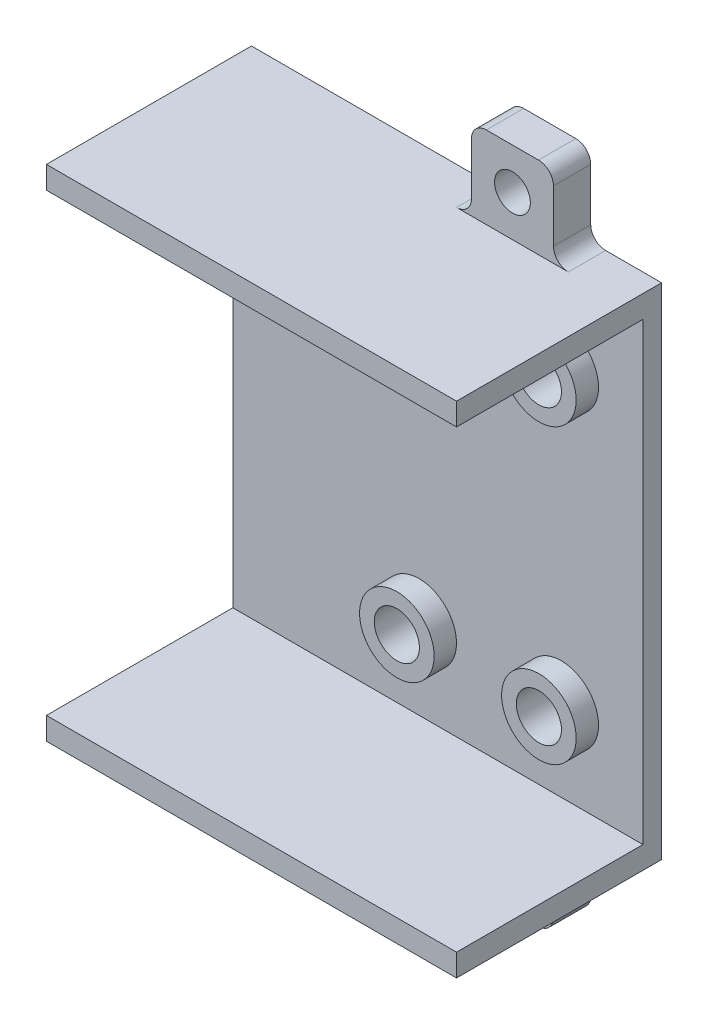
ISO-10303-21;
HEADER;
FILE_DESCRIPTION(('STEP AP214'),'2;1');
FILE_NAME('part.step','',(''),(''),'','','');
FILE_SCHEMA(('AUTOMOTIVE_DESIGN { 1 0 10303 214 1 1 1 1 }'));
ENDSEC;
DATA;
#1=APPLICATION_CONTEXT('core data for automotive mechanical design processes');
#2=APPLICATION_PROTOCOL_DEFINITION('international standard','automotive_design',2000,#1);
#3=PRODUCT_CONTEXT('',#1,'mechanical');
#4=PRODUCT('Part','Part','',(#3));
#5=PRODUCT_RELATED_PRODUCT_CATEGORY('part','',(#4));
#6=PRODUCT_DEFINITION_FORMATION('','',#4);
#7=PRODUCT_DEFINITION_CONTEXT('part definition',#1,'design');
#8=PRODUCT_DEFINITION('design','',#6,#7);
#9=PRODUCT_DEFINITION_SHAPE('','',#8);
#10=(LENGTH_UNIT() NAMED_UNIT(*) SI_UNIT(.MILLI.,.METRE.));
#11=(NAMED_UNIT(*) PLANE_ANGLE_UNIT() SI_UNIT($,.RADIAN.));
#12=(NAMED_UNIT(*) SI_UNIT($,.STERADIAN.) SOLID_ANGLE_UNIT());
#13=UNCERTAINTY_MEASURE_WITH_UNIT(LENGTH_MEASURE(1.E-05),#10,'distance_accuracy_value','');
#14=(GEOMETRIC_REPRESENTATION_CONTEXT(3) GLOBAL_UNCERTAINTY_ASSIGNED_CONTEXT((#13)) GLOBAL_UNIT_ASSIGNED_CONTEXT((#10,
#11,#12)) REPRESENTATION_CONTEXT('',''));
#15=CARTESIAN_POINT('',(0.,0.,0.));
#16=DIRECTION('',(0.,0.,1.));
#17=DIRECTION('',(1.,0.,0.));
#18=AXIS2_PLACEMENT_3D('',#15,#16,#17);
#19=CARTESIAN_POINT('',(-27.5,-33.5,2.5));
#20=DIRECTION('',(0.,1.,0.));
#21=DIRECTION('',(0.,0.,1.));
#22=AXIS2_PLACEMENT_3D('',#19,#20,#21);
#23=PLANE('',#22);
#24=DIRECTION('',(1.,0.,0.));
#25=VECTOR('',#24,1.);
#26=CARTESIAN_POINT('',(0.,-33.5,5.));
#27=LINE('',#26,#25);
#28=CARTESIAN_POINT('',(5.,-33.5,5.));
#29=VERTEX_POINT('',#28);
#30=CARTESIAN_POINT('',(20.,-33.5,5.));
#31=VERTEX_POINT('',#30);
#32=EDGE_CURVE('E480',#29,#31,#27,.T.);
#33=ORIENTED_EDGE('',*,*,#32,.T.);
#34=DIRECTION('',(0.,0.,-1.));
#35=VECTOR('',#34,1.);
#36=CARTESIAN_POINT('',(20.,-33.5,2.5));
#37=LINE('',#36,#35);
#38=CARTESIAN_POINT('',(20.,-33.5,0.));
#39=VERTEX_POINT('',#38);
#40=EDGE_CURVE('E286',#31,#39,#37,.T.);
#41=ORIENTED_EDGE('',*,*,#40,.T.);
#42=DIRECTION('',(1.,0.,0.));
#43=VECTOR('',#42,1.);
#44=CARTESIAN_POINT('',(-27.5,-33.5,0.));
#45=LINE('',#44,#43);
#46=CARTESIAN_POINT('',(27.5,-33.5,0.));
#47=VERTEX_POINT('',#46);
#48=EDGE_CURVE('E212',#39,#47,#45,.T.);
#49=ORIENTED_EDGE('',*,*,#48,.T.);
#50=DIRECTION('',(0.,0.,-1.));
#51=VECTOR('',#50,1.);
#52=CARTESIAN_POINT('',(27.5,-33.5,2.5));
#53=LINE('',#52,#51);
#54=CARTESIAN_POINT('',(27.5,-33.5,27.5));
#55=VERTEX_POINT('',#54);
#56=EDGE_CURVE('E206',#55,#47,#53,.T.);
#57=ORIENTED_EDGE('',*,*,#56,.F.);
#58=DIRECTION('',(1.,0.,0.));
#59=VECTOR('',#58,1.);
#60=CARTESIAN_POINT('',(27.5,-33.5,27.5));
#61=LINE('',#60,#59);
#62=CARTESIAN_POINT('',(-27.5,-33.5,27.5));
#63=VERTEX_POINT('',#62);
#64=EDGE_CURVE('E209',#63,#55,#61,.T.);
#65=ORIENTED_EDGE('',*,*,#64,.F.);
#66=DIRECTION('',(0.,0.,-1.));
#67=VECTOR('',#66,1.);
#68=CARTESIAN_POINT('',(-27.5,-33.5,2.5));
#69=LINE('',#68,#67);
#70=CARTESIAN_POINT('',(-27.5,-33.5,0.));
#71=VERTEX_POINT('',#70);
#72=EDGE_CURVE('E217',#63,#71,#69,.T.);
#73=ORIENTED_EDGE('',*,*,#72,.T.);
#74=CARTESIAN_POINT('',(4.99999999999999,-33.5,0.));
#75=VERTEX_POINT('',#74);
#76=EDGE_CURVE('E265',#71,#75,#45,.T.);
#77=ORIENTED_EDGE('',*,*,#76,.T.);
#78=DIRECTION('',(0.,0.,-1.));
#79=VECTOR('',#78,1.);
#80=CARTESIAN_POINT('',(5.,-33.5,5.));
#81=LINE('',#80,#79);
#82=EDGE_CURVE('E283',#75,#29,#81,.F.);
#83=ORIENTED_EDGE('',*,*,#82,.T.);
#84=EDGE_LOOP('',(#33,#41,#49,#57,#65,#73,#77,#83));
#85=FACE_BOUND('',#84,.T.);
#86=ADVANCED_FACE('F43',(#85),#23,.F.);
#87=CARTESIAN_POINT('',(-27.5,33.5,2.5));
#88=DIRECTION('',(0.,-1.,0.));
#89=DIRECTION('',(0.,0.,-1.));
#90=AXIS2_PLACEMENT_3D('',#87,#88,#89);
#91=PLANE('',#90);
#92=DIRECTION('',(-1.,0.,0.));
#93=VECTOR('',#92,1.);
#94=CARTESIAN_POINT('',(-27.5,33.5,0.));
#95=LINE('',#94,#93);
#96=CARTESIAN_POINT('',(27.5,33.5,0.));
#97=VERTEX_POINT('',#96);
#98=CARTESIAN_POINT('',(20.,33.5,0.));
#99=VERTEX_POINT('',#98);
#100=EDGE_CURVE('E269',#97,#99,#95,.T.);
#101=ORIENTED_EDGE('',*,*,#100,.T.);
#102=DIRECTION('',(0.,0.,-1.));
#103=VECTOR('',#102,1.);
#104=CARTESIAN_POINT('',(20.,33.5,5.));
#105=LINE('',#104,#103);
#106=CARTESIAN_POINT('',(20.,33.5,5.));
#107=VERTEX_POINT('',#106);
#108=EDGE_CURVE('E323',#99,#107,#105,.F.);
#109=ORIENTED_EDGE('',*,*,#108,.T.);
#110=DIRECTION('',(1.,0.,0.));
#111=VECTOR('',#110,1.);
#112=CARTESIAN_POINT('',(0.,33.5,5.));
#113=LINE('',#112,#111);
#114=CARTESIAN_POINT('',(5.,33.5,5.));
#115=VERTEX_POINT('',#114);
#116=EDGE_CURVE('E367',#115,#107,#113,.T.);
#117=ORIENTED_EDGE('',*,*,#116,.F.);
#118=DIRECTION('',(0.,0.,-1.));
#119=VECTOR('',#118,1.);
#120=CARTESIAN_POINT('',(5.,33.5,2.5));
#121=LINE('',#120,#119);
#122=CARTESIAN_POINT('',(5.,33.5,0.));
#123=VERTEX_POINT('',#122);
#124=EDGE_CURVE('E320',#115,#123,#121,.T.);
#125=ORIENTED_EDGE('',*,*,#124,.T.);
#126=CARTESIAN_POINT('',(-27.5,33.5,0.));
#127=VERTEX_POINT('',#126);
#128=EDGE_CURVE('E268',#123,#127,#95,.T.);
#129=ORIENTED_EDGE('',*,*,#128,.T.);
#130=DIRECTION('',(0.,0.,-1.));
#131=VECTOR('',#130,1.);
#132=CARTESIAN_POINT('',(-27.5,33.5,2.5));
#133=LINE('',#132,#131);
#134=CARTESIAN_POINT('',(-27.5,33.5,27.5));
#135=VERTEX_POINT('',#134);
#136=EDGE_CURVE('E277',#135,#127,#133,.T.);
#137=ORIENTED_EDGE('',*,*,#136,.F.);
#138=DIRECTION('',(-1.,0.,0.));
#139=VECTOR('',#138,1.);
#140=CARTESIAN_POINT('',(-27.5,33.5,27.5));
#141=LINE('',#140,#139);
#142=CARTESIAN_POINT('',(27.5,33.5,27.5));
#143=VERTEX_POINT('',#142);
#144=EDGE_CURVE('E251',#143,#135,#141,.T.);
#145=ORIENTED_EDGE('',*,*,#144,.F.);
#146=DIRECTION('',(0.,0.,-1.));
#147=VECTOR('',#146,1.);
#148=CARTESIAN_POINT('',(27.5,33.5,2.5));
#149=LINE('',#148,#147);
#150=EDGE_CURVE('E280',#143,#97,#149,.T.);
#151=ORIENTED_EDGE('',*,*,#150,.T.);
#152=EDGE_LOOP('',(#101,#109,#117,#125,#129,#137,#145,#151));
#153=FACE_BOUND('',#152,.T.);
#154=ADVANCED_FACE('F448',(#153),#91,.F.);
#155=CARTESIAN_POINT('',(0.,0.,2.5));
#156=DIRECTION('',(0.,0.,1.));
#157=DIRECTION('',(1.,0.,0.));
#158=AXIS2_PLACEMENT_3D('',#155,#156,#157);
#159=PLANE('',#158);
#160=CARTESIAN_POINT('',(-2.50399999999998,-19.6215,2.5));
#161=DIRECTION('',(0.,0.,1.));
#162=DIRECTION('',(1.,0.,0.));
#163=AXIS2_PLACEMENT_3D('',#160,#161,#162);
#164=CIRCLE('',#163,5.);
#165=CARTESIAN_POINT('',(2.49600000000002,-19.6215,2.5));
#166=VERTEX_POINT('',#165);
#167=EDGE_CURVE('E393',#166,#166,#164,.T.);
#168=ORIENTED_EDGE('',*,*,#167,.F.);
#169=EDGE_LOOP('',(#168));
#170=FACE_BOUND('',#169,.T.);
#171=CARTESIAN_POINT('',(16.546,-19.6215,2.5));
#172=DIRECTION('',(0.,0.,1.));
#173=DIRECTION('',(1.,0.,0.));
#174=AXIS2_PLACEMENT_3D('',#171,#172,#173);
#175=CIRCLE('',#174,5.);
#176=CARTESIAN_POINT('',(21.546,-19.6215,2.5));
#177=VERTEX_POINT('',#176);
#178=EDGE_CURVE('E402',#177,#177,#175,.T.);
#179=ORIENTED_EDGE('',*,*,#178,.F.);
#180=EDGE_LOOP('',(#179));
#181=FACE_BOUND('',#180,.T.);
#182=CARTESIAN_POINT('',(16.546,19.6215,2.5));
#183=DIRECTION('',(0.,0.,1.));
#184=DIRECTION('',(1.,0.,0.));
#185=AXIS2_PLACEMENT_3D('',#182,#183,#184);
#186=CIRCLE('',#185,5.);
#187=CARTESIAN_POINT('',(21.546,19.6215,2.5));
#188=VERTEX_POINT('',#187);
#189=EDGE_CURVE('E411',#188,#188,#186,.T.);
#190=ORIENTED_EDGE('',*,*,#189,.F.);
#191=EDGE_LOOP('',(#190));
#192=FACE_BOUND('',#191,.T.);
#193=CARTESIAN_POINT('',(-2.50399999999998,19.6215,2.5));
#194=DIRECTION('',(0.,0.,1.));
#195=DIRECTION('',(1.,0.,0.));
#196=AXIS2_PLACEMENT_3D('',#193,#194,#195);
#197=CIRCLE('',#196,5.);
#198=CARTESIAN_POINT('',(2.49600000000002,19.6215,2.5));
#199=VERTEX_POINT('',#198);
#200=EDGE_CURVE('E422',#199,#199,#197,.T.);
#201=ORIENTED_EDGE('',*,*,#200,.F.);
#202=EDGE_LOOP('',(#201));
#203=FACE_BOUND('',#202,.T.);
#204=DIRECTION('',(0.,-1.,0.));
#205=VECTOR('',#204,1.);
#206=CARTESIAN_POINT('',(-27.5,33.5,2.5));
#207=LINE('',#206,#205);
#208=CARTESIAN_POINT('',(-27.5,30.5,2.5));
#209=VERTEX_POINT('',#208);
#210=CARTESIAN_POINT('',(-27.5,-30.5,2.5));
#211=VERTEX_POINT('',#210);
#212=EDGE_CURVE('E218',#209,#211,#207,.T.);
#213=ORIENTED_EDGE('',*,*,#212,.T.);
#214=DIRECTION('',(-1.,0.,0.));
#215=VECTOR('',#214,1.);
#216=CARTESIAN_POINT('',(27.5,-30.5,2.5));
#217=LINE('',#216,#215);
#218=CARTESIAN_POINT('',(27.5,-30.5,2.5));
#219=VERTEX_POINT('',#218);
#220=EDGE_CURVE('E234',#219,#211,#217,.T.);
#221=ORIENTED_EDGE('',*,*,#220,.F.);
#222=DIRECTION('',(0.,1.,0.));
#223=VECTOR('',#222,1.);
#224=CARTESIAN_POINT('',(27.5,33.5,2.5));
#225=LINE('',#224,#223);
#226=CARTESIAN_POINT('',(27.5,30.5,2.5));
#227=VERTEX_POINT('',#226);
#228=EDGE_CURVE('E263',#219,#227,#225,.T.);
#229=ORIENTED_EDGE('',*,*,#228,.T.);
#230=DIRECTION('',(1.,0.,0.));
#231=VECTOR('',#230,1.);
#232=CARTESIAN_POINT('',(-27.5,30.5,2.5));
#233=LINE('',#232,#231);
#234=EDGE_CURVE('E238',#209,#227,#233,.T.);
#235=ORIENTED_EDGE('',*,*,#234,.F.);
#236=EDGE_LOOP('',(#213,#221,#229,#235));
#237=FACE_BOUND('',#236,.T.);
#238=ADVANCED_FACE('F438',(#170,#181,#192,#203,#237),#159,.T.);
#239=CARTESIAN_POINT('',(27.5,33.5,2.5));
#240=DIRECTION('',(-1.,0.,0.));
#241=DIRECTION('',(0.,-1.,0.));
#242=AXIS2_PLACEMENT_3D('',#239,#240,#241);
#243=PLANE('',#242);
#244=DIRECTION('',(0.,1.,0.));
#245=VECTOR('',#244,1.);
#246=CARTESIAN_POINT('',(27.5,33.5,0.));
#247=LINE('',#246,#245);
#248=EDGE_CURVE('E262',#47,#97,#247,.T.);
#249=ORIENTED_EDGE('',*,*,#248,.T.);
#250=ORIENTED_EDGE('',*,*,#150,.F.);
#251=DIRECTION('',(0.,1.,0.));
#252=VECTOR('',#251,1.);
#253=CARTESIAN_POINT('',(27.5,33.5,27.5));
#254=LINE('',#253,#252);
#255=CARTESIAN_POINT('',(27.5,30.5,27.5));
#256=VERTEX_POINT('',#255);
#257=EDGE_CURVE('E248',#256,#143,#254,.T.);
#258=ORIENTED_EDGE('',*,*,#257,.F.);
#259=DIRECTION('',(0.,0.,-1.));
#260=VECTOR('',#259,1.);
#261=CARTESIAN_POINT('',(27.5,30.5,27.5));
#262=LINE('',#261,#260);
#263=EDGE_CURVE('E254',#256,#227,#262,.T.);
#264=ORIENTED_EDGE('',*,*,#263,.T.);
#265=ORIENTED_EDGE('',*,*,#228,.F.);
#266=DIRECTION('',(0.,0.,-1.));
#267=VECTOR('',#266,1.);
#268=CARTESIAN_POINT('',(27.5,-30.5,27.5));
#269=LINE('',#268,#267);
#270=CARTESIAN_POINT('',(27.5,-30.5,27.5));
#271=VERTEX_POINT('',#270);
#272=EDGE_CURVE('E233',#271,#219,#269,.T.);
#273=ORIENTED_EDGE('',*,*,#272,.F.);
#274=DIRECTION('',(0.,1.,0.));
#275=VECTOR('',#274,1.);
#276=CARTESIAN_POINT('',(27.5,-33.5,27.5));
#277=LINE('',#276,#275);
#278=EDGE_CURVE('E224',#55,#271,#277,.T.);
#279=ORIENTED_EDGE('',*,*,#278,.F.);
#280=ORIENTED_EDGE('',*,*,#56,.T.);
#281=EDGE_LOOP('',(#249,#250,#258,#264,#265,#273,#279,#280));
#282=FACE_BOUND('',#281,.T.);
#283=ADVANCED_FACE('F230',(#282),#243,.F.);
#284=CARTESIAN_POINT('',(-27.5,33.5,2.5));
#285=DIRECTION('',(1.,0.,0.));
#286=DIRECTION('',(0.,1.,0.));
#287=AXIS2_PLACEMENT_3D('',#284,#285,#286);
#288=PLANE('',#287);
#289=DIRECTION('',(0.,-1.,0.));
#290=VECTOR('',#289,1.);
#291=CARTESIAN_POINT('',(-27.5,33.5,0.));
#292=LINE('',#291,#290);
#293=EDGE_CURVE('E272',#127,#71,#292,.T.);
#294=ORIENTED_EDGE('',*,*,#293,.T.);
#295=ORIENTED_EDGE('',*,*,#72,.F.);
#296=DIRECTION('',(0.,-1.,0.));
#297=VECTOR('',#296,1.);
#298=CARTESIAN_POINT('',(-27.5,-33.5,27.5));
#299=LINE('',#298,#297);
#300=CARTESIAN_POINT('',(-27.5,-30.5,27.5));
#301=VERTEX_POINT('',#300);
#302=EDGE_CURVE('E227',#301,#63,#299,.T.);
#303=ORIENTED_EDGE('',*,*,#302,.F.);
#304=DIRECTION('',(0.,0.,-1.));
#305=VECTOR('',#304,1.);
#306=CARTESIAN_POINT('',(-27.5,-30.5,27.5));
#307=LINE('',#306,#305);
#308=EDGE_CURVE('E228',#301,#211,#307,.T.);
#309=ORIENTED_EDGE('',*,*,#308,.T.);
#310=ORIENTED_EDGE('',*,*,#212,.F.);
#311=DIRECTION('',(0.,0.,-1.));
#312=VECTOR('',#311,1.);
#313=CARTESIAN_POINT('',(-27.5,30.5,27.5));
#314=LINE('',#313,#312);
#315=CARTESIAN_POINT('',(-27.5,30.5,27.5));
#316=VERTEX_POINT('',#315);
#317=EDGE_CURVE('E259',#316,#209,#314,.T.);
#318=ORIENTED_EDGE('',*,*,#317,.F.);
#319=DIRECTION('',(0.,-1.,0.));
#320=VECTOR('',#319,1.);
#321=CARTESIAN_POINT('',(-27.5,33.5,27.5));
#322=LINE('',#321,#320);
#323=EDGE_CURVE('E243',#135,#316,#322,.T.);
#324=ORIENTED_EDGE('',*,*,#323,.F.);
#325=ORIENTED_EDGE('',*,*,#136,.T.);
#326=EDGE_LOOP('',(#294,#295,#303,#309,#310,#318,#324,#325));
#327=FACE_BOUND('',#326,.T.);
#328=ADVANCED_FACE('F433',(#327),#288,.F.);
#329=CARTESIAN_POINT('',(0.,0.,0.));
#330=DIRECTION('',(0.,0.,1.));
#331=DIRECTION('',(1.,0.,0.));
#332=AXIS2_PLACEMENT_3D('',#329,#330,#331);
#333=PLANE('',#332);
#334=CARTESIAN_POINT('',(12.5,-39.,0.));
#335=DIRECTION('',(0.,0.,1.));
#336=DIRECTION('',(1.,0.,0.));
#337=AXIS2_PLACEMENT_3D('',#334,#335,#336);
#338=CIRCLE('',#337,2.4);
#339=CARTESIAN_POINT('',(14.9,-39.,0.));
#340=VERTEX_POINT('',#339);
#341=EDGE_CURVE('E477',#340,#340,#338,.T.);
#342=ORIENTED_EDGE('',*,*,#341,.T.);
#343=EDGE_LOOP('',(#342));
#344=FACE_BOUND('',#343,.T.);
#345=CARTESIAN_POINT('',(12.5,39.,0.));
#346=DIRECTION('',(0.,0.,1.));
#347=DIRECTION('',(1.,0.,0.));
#348=AXIS2_PLACEMENT_3D('',#345,#346,#347);
#349=CIRCLE('',#348,2.4);
#350=CARTESIAN_POINT('',(14.9,39.,0.));
#351=VERTEX_POINT('',#350);
#352=EDGE_CURVE('E381',#351,#351,#349,.T.);
#353=ORIENTED_EDGE('',*,*,#352,.T.);
#354=EDGE_LOOP('',(#353));
#355=FACE_BOUND('',#354,.T.);
#356=DIRECTION('',(0.,-1.,0.));
#357=VECTOR('',#356,1.);
#358=CARTESIAN_POINT('',(18.,0.,0.));
#359=LINE('',#358,#357);
#360=CARTESIAN_POINT('',(18.,-35.5,0.));
#361=VERTEX_POINT('',#360);
#362=CARTESIAN_POINT('',(18.,-42.5,0.));
#363=VERTEX_POINT('',#362);
#364=EDGE_CURVE('E468',#361,#363,#359,.T.);
#365=ORIENTED_EDGE('',*,*,#364,.T.);
#366=CARTESIAN_POINT('',(16.,-42.5,0.));
#367=DIRECTION('',(0.,0.,1.));
#368=DIRECTION('',(1.,0.,0.));
#369=AXIS2_PLACEMENT_3D('',#366,#367,#368);
#370=CIRCLE('',#369,2.);
#371=CARTESIAN_POINT('',(16.,-44.5,0.));
#372=VERTEX_POINT('',#371);
#373=EDGE_CURVE('E299',#363,#372,#370,.F.);
#374=ORIENTED_EDGE('',*,*,#373,.T.);
#375=DIRECTION('',(-1.,0.,0.));
#376=VECTOR('',#375,1.);
#377=CARTESIAN_POINT('',(0.,-44.5,0.));
#378=LINE('',#377,#376);
#379=CARTESIAN_POINT('',(9.,-44.5,0.));
#380=VERTEX_POINT('',#379);
#381=EDGE_CURVE('E474',#372,#380,#378,.T.);
#382=ORIENTED_EDGE('',*,*,#381,.T.);
#383=CARTESIAN_POINT('',(9.,-42.5,0.));
#384=DIRECTION('',(0.,0.,1.));
#385=DIRECTION('',(1.,0.,0.));
#386=AXIS2_PLACEMENT_3D('',#383,#384,#385);
#387=CIRCLE('',#386,2.);
#388=CARTESIAN_POINT('',(7.,-42.5,0.));
#389=VERTEX_POINT('',#388);
#390=EDGE_CURVE('E297',#380,#389,#387,.F.);
#391=ORIENTED_EDGE('',*,*,#390,.T.);
#392=DIRECTION('',(0.,-1.,0.));
#393=VECTOR('',#392,1.);
#394=CARTESIAN_POINT('',(6.99999999999999,0.,0.));
#395=LINE('',#394,#393);
#396=CARTESIAN_POINT('',(7.,-35.5,0.));
#397=VERTEX_POINT('',#396);
#398=EDGE_CURVE('E471',#397,#389,#395,.T.);
#399=ORIENTED_EDGE('',*,*,#398,.F.);
#400=CARTESIAN_POINT('',(5.,-35.5,0.));
#401=DIRECTION('',(0.,0.,1.));
#402=DIRECTION('',(1.,0.,0.));
#403=AXIS2_PLACEMENT_3D('',#400,#401,#402);
#404=CIRCLE('',#403,2.);
#405=EDGE_CURVE('E343',#397,#75,#404,.T.);
#406=ORIENTED_EDGE('',*,*,#405,.T.);
#407=ORIENTED_EDGE('',*,*,#76,.F.);
#408=ORIENTED_EDGE('',*,*,#293,.F.);
#409=ORIENTED_EDGE('',*,*,#128,.F.);
#410=CARTESIAN_POINT('',(5.,35.5,0.));
#411=DIRECTION('',(0.,0.,1.));
#412=DIRECTION('',(1.,0.,0.));
#413=AXIS2_PLACEMENT_3D('',#410,#411,#412);
#414=CIRCLE('',#413,2.);
#415=CARTESIAN_POINT('',(7.,35.5,0.));
#416=VERTEX_POINT('',#415);
#417=EDGE_CURVE('E51',#123,#416,#414,.T.);
#418=ORIENTED_EDGE('',*,*,#417,.T.);
#419=DIRECTION('',(0.,1.,0.));
#420=VECTOR('',#419,1.);
#421=CARTESIAN_POINT('',(6.99999999999999,0.,0.));
#422=LINE('',#421,#420);
#423=CARTESIAN_POINT('',(7.,42.5,0.));
#424=VERTEX_POINT('',#423);
#425=EDGE_CURVE('E355',#416,#424,#422,.T.);
#426=ORIENTED_EDGE('',*,*,#425,.T.);
#427=CARTESIAN_POINT('',(9.,42.5,0.));
#428=DIRECTION('',(0.,0.,1.));
#429=DIRECTION('',(1.,0.,0.));
#430=AXIS2_PLACEMENT_3D('',#427,#428,#429);
#431=CIRCLE('',#430,2.);
#432=CARTESIAN_POINT('',(9.,44.5,0.));
#433=VERTEX_POINT('',#432);
#434=EDGE_CURVE('E293',#424,#433,#431,.F.);
#435=ORIENTED_EDGE('',*,*,#434,.T.);
#436=DIRECTION('',(-1.,0.,0.));
#437=VECTOR('',#436,1.);
#438=CARTESIAN_POINT('',(0.,44.5,0.));
#439=LINE('',#438,#437);
#440=CARTESIAN_POINT('',(16.,44.5,0.));
#441=VERTEX_POINT('',#440);
#442=EDGE_CURVE('E378',#441,#433,#439,.T.);
#443=ORIENTED_EDGE('',*,*,#442,.F.);
#444=CARTESIAN_POINT('',(16.,42.5,0.));
#445=DIRECTION('',(0.,0.,1.));
#446=DIRECTION('',(1.,0.,0.));
#447=AXIS2_PLACEMENT_3D('',#444,#445,#446);
#448=CIRCLE('',#447,2.);
#449=CARTESIAN_POINT('',(18.,42.5,0.));
#450=VERTEX_POINT('',#449);
#451=EDGE_CURVE('E295',#441,#450,#448,.F.);
#452=ORIENTED_EDGE('',*,*,#451,.T.);
#453=DIRECTION('',(0.,1.,0.));
#454=VECTOR('',#453,1.);
#455=CARTESIAN_POINT('',(18.,0.,0.));
#456=LINE('',#455,#454);
#457=CARTESIAN_POINT('',(18.,35.5,0.));
#458=VERTEX_POINT('',#457);
#459=EDGE_CURVE('E362',#458,#450,#456,.T.);
#460=ORIENTED_EDGE('',*,*,#459,.F.);
#461=CARTESIAN_POINT('',(20.,35.5,0.));
#462=DIRECTION('',(0.,0.,1.));
#463=DIRECTION('',(1.,0.,0.));
#464=AXIS2_PLACEMENT_3D('',#461,#462,#463);
#465=CIRCLE('',#464,2.);
#466=EDGE_CURVE('E347',#458,#99,#465,.T.);
#467=ORIENTED_EDGE('',*,*,#466,.T.);
#468=ORIENTED_EDGE('',*,*,#100,.F.);
#469=ORIENTED_EDGE('',*,*,#248,.F.);
#470=ORIENTED_EDGE('',*,*,#48,.F.);
#471=CARTESIAN_POINT('',(20.,-35.5,0.));
#472=DIRECTION('',(0.,0.,1.));
#473=DIRECTION('',(1.,0.,0.));
#474=AXIS2_PLACEMENT_3D('',#471,#472,#473);
#475=CIRCLE('',#474,2.);
#476=EDGE_CURVE('E338',#39,#361,#475,.T.);
#477=ORIENTED_EDGE('',*,*,#476,.T.);
#478=EDGE_LOOP('',(#365,#374,#382,#391,#399,#406,#407,#408,#409,#418,#426,#435,#443,#452,#460,
#467,#468,#469,#470,#477));
#479=FACE_BOUND('',#478,.T.);
#480=ADVANCED_FACE('F354',(#344,#355,#479),#333,.F.);
#481=CARTESIAN_POINT('',(-27.5,30.5,27.5));
#482=DIRECTION('',(0.,1.,0.));
#483=DIRECTION('',(-1.,0.,0.));
#484=AXIS2_PLACEMENT_3D('',#481,#482,#483);
#485=PLANE('',#484);
#486=ORIENTED_EDGE('',*,*,#234,.T.);
#487=ORIENTED_EDGE('',*,*,#263,.F.);
#488=DIRECTION('',(1.,0.,0.));
#489=VECTOR('',#488,1.);
#490=CARTESIAN_POINT('',(-27.5,30.5,27.5));
#491=LINE('',#490,#489);
#492=EDGE_CURVE('E246',#316,#256,#491,.T.);
#493=ORIENTED_EDGE('',*,*,#492,.F.);
#494=ORIENTED_EDGE('',*,*,#317,.T.);
#495=EDGE_LOOP('',(#486,#487,#493,#494));
#496=FACE_BOUND('',#495,.T.);
#497=ADVANCED_FACE('F442',(#496),#485,.F.);
#498=CARTESIAN_POINT('',(0.,0.,27.5));
#499=DIRECTION('',(0.,0.,1.));
#500=DIRECTION('',(1.,0.,0.));
#501=AXIS2_PLACEMENT_3D('',#498,#499,#500);
#502=PLANE('',#501);
#503=ORIENTED_EDGE('',*,*,#323,.T.);
#504=ORIENTED_EDGE('',*,*,#492,.T.);
#505=ORIENTED_EDGE('',*,*,#257,.T.);
#506=ORIENTED_EDGE('',*,*,#144,.T.);
#507=EDGE_LOOP('',(#503,#504,#505,#506));
#508=FACE_BOUND('',#507,.T.);
#509=ADVANCED_FACE('F445',(#508),#502,.T.);
#510=CARTESIAN_POINT('',(27.5,-30.5,27.5));
#511=DIRECTION('',(0.,-1.,0.));
#512=DIRECTION('',(1.,0.,0.));
#513=AXIS2_PLACEMENT_3D('',#510,#511,#512);
#514=PLANE('',#513);
#515=ORIENTED_EDGE('',*,*,#220,.T.);
#516=ORIENTED_EDGE('',*,*,#308,.F.);
#517=DIRECTION('',(-1.,0.,0.));
#518=VECTOR('',#517,1.);
#519=CARTESIAN_POINT('',(27.5,-30.5,27.5));
#520=LINE('',#519,#518);
#521=EDGE_CURVE('E235',#271,#301,#520,.T.);
#522=ORIENTED_EDGE('',*,*,#521,.F.);
#523=ORIENTED_EDGE('',*,*,#272,.T.);
#524=EDGE_LOOP('',(#515,#516,#522,#523));
#525=FACE_BOUND('',#524,.T.);
#526=ADVANCED_FACE('F436',(#525),#514,.F.);
#527=CARTESIAN_POINT('',(0.,0.,27.5));
#528=DIRECTION('',(0.,0.,1.));
#529=DIRECTION('',(1.,0.,0.));
#530=AXIS2_PLACEMENT_3D('',#527,#528,#529);
#531=PLANE('',#530);
#532=ORIENTED_EDGE('',*,*,#278,.T.);
#533=ORIENTED_EDGE('',*,*,#521,.T.);
#534=ORIENTED_EDGE('',*,*,#302,.T.);
#535=ORIENTED_EDGE('',*,*,#64,.T.);
#536=EDGE_LOOP('',(#532,#533,#534,#535));
#537=FACE_BOUND('',#536,.T.);
#538=ADVANCED_FACE('F223',(#537),#531,.T.);
#539=CARTESIAN_POINT('',(-2.50399999999998,19.6215,5.5));
#540=DIRECTION('',(0.,0.,1.));
#541=DIRECTION('',(1.,0.,0.));
#542=AXIS2_PLACEMENT_3D('',#539,#540,#541);
#543=PLANE('',#542);
#544=CARTESIAN_POINT('',(-2.50399999999998,19.6215,5.5));
#545=DIRECTION('',(0.,0.,1.));
#546=DIRECTION('',(1.,0.,0.));
#547=AXIS2_PLACEMENT_3D('',#544,#545,#546);
#548=CIRCLE('',#547,5.);
#549=CARTESIAN_POINT('',(2.49600000000002,19.6215,5.5));
#550=VERTEX_POINT('',#549);
#551=EDGE_CURVE('E423',#550,#550,#548,.T.);
#552=ORIENTED_EDGE('',*,*,#551,.T.);
#553=EDGE_LOOP('',(#552));
#554=FACE_BOUND('',#553,.T.);
#555=CARTESIAN_POINT('',(-2.50399999999998,19.6215,5.5));
#556=DIRECTION('',(0.,0.,1.));
#557=DIRECTION('',(1.,0.,0.));
#558=AXIS2_PLACEMENT_3D('',#555,#556,#557);
#559=CIRCLE('',#558,3.025);
#560=CARTESIAN_POINT('',(0.521000000000021,19.6215,5.5));
#561=VERTEX_POINT('',#560);
#562=EDGE_CURVE('E419',#561,#561,#559,.T.);
#563=ORIENTED_EDGE('',*,*,#562,.F.);
#564=EDGE_LOOP('',(#563));
#565=FACE_BOUND('',#564,.T.);
#566=ADVANCED_FACE('F649',(#554,#565),#543,.T.);
#567=CARTESIAN_POINT('',(-2.50399999999998,19.6215,5.5));
#568=DIRECTION('',(0.,0.,-1.));
#569=DIRECTION('',(-1.,0.,0.));
#570=AXIS2_PLACEMENT_3D('',#567,#568,#569);
#571=CYLINDRICAL_SURFACE('',#570,5.);
#572=ORIENTED_EDGE('',*,*,#551,.F.);
#573=EDGE_LOOP('',(#572));
#574=FACE_BOUND('',#573,.T.);
#575=ORIENTED_EDGE('',*,*,#200,.T.);
#576=EDGE_LOOP('',(#575));
#577=FACE_BOUND('',#576,.T.);
#578=ADVANCED_FACE('F647',(#574,#577),#571,.T.);
#579=CARTESIAN_POINT('',(-2.50399999999998,19.6215,5.5));
#580=DIRECTION('',(0.,0.,-1.));
#581=DIRECTION('',(-1.,0.,0.));
#582=AXIS2_PLACEMENT_3D('',#579,#580,#581);
#583=CYLINDRICAL_SURFACE('',#582,3.025);
#584=ORIENTED_EDGE('',*,*,#562,.T.);
#585=EDGE_LOOP('',(#584));
#586=FACE_BOUND('',#585,.T.);
#587=CARTESIAN_POINT('',(-2.50399999999998,19.6215,0.5));
#588=DIRECTION('',(0.,0.,1.));
#589=DIRECTION('',(1.,0.,0.));
#590=AXIS2_PLACEMENT_3D('',#587,#588,#589);
#591=CIRCLE('',#590,3.025);
#592=CARTESIAN_POINT('',(0.521000000000021,19.6215,0.5));
#593=VERTEX_POINT('',#592);
#594=EDGE_CURVE('E369',#593,#593,#591,.T.);
#595=ORIENTED_EDGE('',*,*,#594,.F.);
#596=EDGE_LOOP('',(#595));
#597=FACE_BOUND('',#596,.T.);
#598=ADVANCED_FACE('F640',(#586,#597),#583,.F.);
#599=CARTESIAN_POINT('',(16.546,19.6215,5.5));
#600=DIRECTION('',(0.,0.,1.));
#601=DIRECTION('',(1.,0.,0.));
#602=AXIS2_PLACEMENT_3D('',#599,#600,#601);
#603=PLANE('',#602);
#604=CARTESIAN_POINT('',(16.546,19.6215,5.5));
#605=DIRECTION('',(0.,0.,1.));
#606=DIRECTION('',(1.,0.,0.));
#607=AXIS2_PLACEMENT_3D('',#604,#605,#606);
#608=CIRCLE('',#607,5.);
#609=CARTESIAN_POINT('',(21.546,19.6215,5.5));
#610=VERTEX_POINT('',#609);
#611=EDGE_CURVE('E410',#610,#610,#608,.T.);
#612=ORIENTED_EDGE('',*,*,#611,.T.);
#613=EDGE_LOOP('',(#612));
#614=FACE_BOUND('',#613,.T.);
#615=CARTESIAN_POINT('',(16.546,19.6215,5.5));
#616=DIRECTION('',(0.,0.,1.));
#617=DIRECTION('',(1.,0.,0.));
#618=AXIS2_PLACEMENT_3D('',#615,#616,#617);
#619=CIRCLE('',#618,3.025);
#620=CARTESIAN_POINT('',(19.571,19.6215,5.5));
#621=VERTEX_POINT('',#620);
#622=EDGE_CURVE('E414',#621,#621,#619,.T.);
#623=ORIENTED_EDGE('',*,*,#622,.F.);
#624=EDGE_LOOP('',(#623));
#625=FACE_BOUND('',#624,.T.);
#626=ADVANCED_FACE('F636',(#614,#625),#603,.T.);
#627=CARTESIAN_POINT('',(16.546,19.6215,5.5));
#628=DIRECTION('',(0.,0.,-1.));
#629=DIRECTION('',(-1.,0.,0.));
#630=AXIS2_PLACEMENT_3D('',#627,#628,#629);
#631=CYLINDRICAL_SURFACE('',#630,5.);
#632=ORIENTED_EDGE('',*,*,#611,.F.);
#633=EDGE_LOOP('',(#632));
#634=FACE_BOUND('',#633,.T.);
#635=ORIENTED_EDGE('',*,*,#189,.T.);
#636=EDGE_LOOP('',(#635));
#637=FACE_BOUND('',#636,.T.);
#638=ADVANCED_FACE('F633',(#634,#637),#631,.T.);
#639=CARTESIAN_POINT('',(16.546,19.6215,5.5));
#640=DIRECTION('',(0.,0.,-1.));
#641=DIRECTION('',(-1.,0.,0.));
#642=AXIS2_PLACEMENT_3D('',#639,#640,#641);
#643=CYLINDRICAL_SURFACE('',#642,3.025);
#644=ORIENTED_EDGE('',*,*,#622,.T.);
#645=EDGE_LOOP('',(#644));
#646=FACE_BOUND('',#645,.T.);
#647=CARTESIAN_POINT('',(16.546,19.6215,0.5));
#648=DIRECTION('',(0.,0.,1.));
#649=DIRECTION('',(1.,0.,0.));
#650=AXIS2_PLACEMENT_3D('',#647,#648,#649);
#651=CIRCLE('',#650,3.025);
#652=CARTESIAN_POINT('',(19.571,19.6215,0.5));
#653=VERTEX_POINT('',#652);
#654=EDGE_CURVE('E372',#653,#653,#651,.T.);
#655=ORIENTED_EDGE('',*,*,#654,.F.);
#656=EDGE_LOOP('',(#655));
#657=FACE_BOUND('',#656,.T.);
#658=ADVANCED_FACE('F628',(#646,#657),#643,.F.);
#659=CARTESIAN_POINT('',(16.546,-19.6215,5.5));
#660=DIRECTION('',(0.,0.,1.));
#661=DIRECTION('',(1.,0.,0.));
#662=AXIS2_PLACEMENT_3D('',#659,#660,#661);
#663=PLANE('',#662);
#664=CARTESIAN_POINT('',(16.546,-19.6215,5.5));
#665=DIRECTION('',(0.,0.,1.));
#666=DIRECTION('',(1.,0.,0.));
#667=AXIS2_PLACEMENT_3D('',#664,#665,#666);
#668=CIRCLE('',#667,5.);
#669=CARTESIAN_POINT('',(21.546,-19.6215,5.5));
#670=VERTEX_POINT('',#669);
#671=EDGE_CURVE('E401',#670,#670,#668,.T.);
#672=ORIENTED_EDGE('',*,*,#671,.T.);
#673=EDGE_LOOP('',(#672));
#674=FACE_BOUND('',#673,.T.);
#675=CARTESIAN_POINT('',(16.546,-19.6215,5.5));
#676=DIRECTION('',(0.,0.,1.));
#677=DIRECTION('',(1.,0.,0.));
#678=AXIS2_PLACEMENT_3D('',#675,#676,#677);
#679=CIRCLE('',#678,3.025);
#680=CARTESIAN_POINT('',(19.571,-19.6215,5.5));
#681=VERTEX_POINT('',#680);
#682=EDGE_CURVE('E405',#681,#681,#679,.T.);
#683=ORIENTED_EDGE('',*,*,#682,.F.);
#684=EDGE_LOOP('',(#683));
#685=FACE_BOUND('',#684,.T.);
#686=ADVANCED_FACE('F624',(#674,#685),#663,.T.);
#687=CARTESIAN_POINT('',(16.546,-19.6215,5.5));
#688=DIRECTION('',(0.,0.,-1.));
#689=DIRECTION('',(-1.,0.,0.));
#690=AXIS2_PLACEMENT_3D('',#687,#688,#689);
#691=CYLINDRICAL_SURFACE('',#690,5.);
#692=ORIENTED_EDGE('',*,*,#671,.F.);
#693=EDGE_LOOP('',(#692));
#694=FACE_BOUND('',#693,.T.);
#695=ORIENTED_EDGE('',*,*,#178,.T.);
#696=EDGE_LOOP('',(#695));
#697=FACE_BOUND('',#696,.T.);
#698=ADVANCED_FACE('F621',(#694,#697),#691,.T.);
#699=CARTESIAN_POINT('',(16.546,-19.6215,5.5));
#700=DIRECTION('',(0.,0.,-1.));
#701=DIRECTION('',(-1.,0.,0.));
#702=AXIS2_PLACEMENT_3D('',#699,#700,#701);
#703=CYLINDRICAL_SURFACE('',#702,3.025);
#704=ORIENTED_EDGE('',*,*,#682,.T.);
#705=EDGE_LOOP('',(#704));
#706=FACE_BOUND('',#705,.T.);
#707=CARTESIAN_POINT('',(16.546,-19.6215,0.5));
#708=DIRECTION('',(0.,0.,1.));
#709=DIRECTION('',(1.,0.,0.));
#710=AXIS2_PLACEMENT_3D('',#707,#708,#709);
#711=CIRCLE('',#710,3.025);
#712=CARTESIAN_POINT('',(19.571,-19.6215,0.5));
#713=VERTEX_POINT('',#712);
#714=EDGE_CURVE('E387',#713,#713,#711,.T.);
#715=ORIENTED_EDGE('',*,*,#714,.F.);
#716=EDGE_LOOP('',(#715));
#717=FACE_BOUND('',#716,.T.);
#718=ADVANCED_FACE('F616',(#706,#717),#703,.F.);
#719=CARTESIAN_POINT('',(-2.50399999999998,-19.6215,5.5));
#720=DIRECTION('',(0.,0.,1.));
#721=DIRECTION('',(1.,0.,0.));
#722=AXIS2_PLACEMENT_3D('',#719,#720,#721);
#723=PLANE('',#722);
#724=CARTESIAN_POINT('',(-2.50399999999998,-19.6215,5.5));
#725=DIRECTION('',(0.,0.,1.));
#726=DIRECTION('',(1.,0.,0.));
#727=AXIS2_PLACEMENT_3D('',#724,#725,#726);
#728=CIRCLE('',#727,5.);
#729=CARTESIAN_POINT('',(2.49600000000002,-19.6215,5.5));
#730=VERTEX_POINT('',#729);
#731=EDGE_CURVE('E392',#730,#730,#728,.T.);
#732=ORIENTED_EDGE('',*,*,#731,.T.);
#733=EDGE_LOOP('',(#732));
#734=FACE_BOUND('',#733,.T.);
#735=CARTESIAN_POINT('',(-2.50399999999998,-19.6215,5.5));
#736=DIRECTION('',(0.,0.,1.));
#737=DIRECTION('',(1.,0.,0.));
#738=AXIS2_PLACEMENT_3D('',#735,#736,#737);
#739=CIRCLE('',#738,3.025);
#740=CARTESIAN_POINT('',(0.521000000000021,-19.6215,5.5));
#741=VERTEX_POINT('',#740);
#742=EDGE_CURVE('E396',#741,#741,#739,.T.);
#743=ORIENTED_EDGE('',*,*,#742,.F.);
#744=EDGE_LOOP('',(#743));
#745=FACE_BOUND('',#744,.T.);
#746=ADVANCED_FACE('F612',(#734,#745),#723,.T.);
#747=CARTESIAN_POINT('',(-2.50399999999998,-19.6215,5.5));
#748=DIRECTION('',(0.,0.,-1.));
#749=DIRECTION('',(-1.,0.,0.));
#750=AXIS2_PLACEMENT_3D('',#747,#748,#749);
#751=CYLINDRICAL_SURFACE('',#750,5.);
#752=ORIENTED_EDGE('',*,*,#731,.F.);
#753=EDGE_LOOP('',(#752));
#754=FACE_BOUND('',#753,.T.);
#755=ORIENTED_EDGE('',*,*,#167,.T.);
#756=EDGE_LOOP('',(#755));
#757=FACE_BOUND('',#756,.T.);
#758=ADVANCED_FACE('F609',(#754,#757),#751,.T.);
#759=CARTESIAN_POINT('',(-2.50399999999998,-19.6215,5.5));
#760=DIRECTION('',(0.,0.,-1.));
#761=DIRECTION('',(-1.,0.,0.));
#762=AXIS2_PLACEMENT_3D('',#759,#760,#761);
#763=CYLINDRICAL_SURFACE('',#762,3.025);
#764=ORIENTED_EDGE('',*,*,#742,.T.);
#765=EDGE_LOOP('',(#764));
#766=FACE_BOUND('',#765,.T.);
#767=CARTESIAN_POINT('',(-2.50399999999998,-19.6215,0.5));
#768=DIRECTION('',(0.,0.,1.));
#769=DIRECTION('',(1.,0.,0.));
#770=AXIS2_PLACEMENT_3D('',#767,#768,#769);
#771=CIRCLE('',#770,3.025);
#772=CARTESIAN_POINT('',(0.521000000000021,-19.6215,0.5));
#773=VERTEX_POINT('',#772);
#774=EDGE_CURVE('E384',#773,#773,#771,.T.);
#775=ORIENTED_EDGE('',*,*,#774,.F.);
#776=EDGE_LOOP('',(#775));
#777=FACE_BOUND('',#776,.T.);
#778=ADVANCED_FACE('F601',(#766,#777),#763,.F.);
#779=CARTESIAN_POINT('',(-2.50399999999998,-19.6215,0.5));
#780=DIRECTION('',(0.,0.,1.));
#781=DIRECTION('',(1.,0.,0.));
#782=AXIS2_PLACEMENT_3D('',#779,#780,#781);
#783=PLANE('',#782);
#784=ORIENTED_EDGE('',*,*,#774,.T.);
#785=EDGE_LOOP('',(#784));
#786=FACE_BOUND('',#785,.T.);
#787=ADVANCED_FACE('F597',(#786),#783,.T.);
#788=CARTESIAN_POINT('',(16.546,-19.6215,0.5));
#789=DIRECTION('',(0.,0.,1.));
#790=DIRECTION('',(1.,0.,0.));
#791=AXIS2_PLACEMENT_3D('',#788,#789,#790);
#792=PLANE('',#791);
#793=ORIENTED_EDGE('',*,*,#714,.T.);
#794=EDGE_LOOP('',(#793));
#795=FACE_BOUND('',#794,.T.);
#796=ADVANCED_FACE('F600',(#795),#792,.T.);
#797=CARTESIAN_POINT('',(16.546,19.6215,0.5));
#798=DIRECTION('',(0.,0.,1.));
#799=DIRECTION('',(1.,0.,0.));
#800=AXIS2_PLACEMENT_3D('',#797,#798,#799);
#801=PLANE('',#800);
#802=ORIENTED_EDGE('',*,*,#654,.T.);
#803=EDGE_LOOP('',(#802));
#804=FACE_BOUND('',#803,.T.);
#805=ADVANCED_FACE('F592',(#804),#801,.T.);
#806=CARTESIAN_POINT('',(-2.50399999999998,19.6215,0.5));
#807=DIRECTION('',(0.,0.,1.));
#808=DIRECTION('',(1.,0.,0.));
#809=AXIS2_PLACEMENT_3D('',#806,#807,#808);
#810=PLANE('',#809);
#811=ORIENTED_EDGE('',*,*,#594,.T.);
#812=EDGE_LOOP('',(#811));
#813=FACE_BOUND('',#812,.T.);
#814=ADVANCED_FACE('F584',(#813),#810,.T.);
#815=CARTESIAN_POINT('',(0.,44.5,5.));
#816=DIRECTION('',(0.,-1.,0.));
#817=DIRECTION('',(1.,0.,0.));
#818=AXIS2_PLACEMENT_3D('',#815,#816,#817);
#819=PLANE('',#818);
#820=DIRECTION('',(-1.,0.,0.));
#821=VECTOR('',#820,1.);
#822=CARTESIAN_POINT('',(0.,44.5,5.));
#823=LINE('',#822,#821);
#824=CARTESIAN_POINT('',(16.,44.5,5.));
#825=VERTEX_POINT('',#824);
#826=CARTESIAN_POINT('',(9.,44.5,5.));
#827=VERTEX_POINT('',#826);
#828=EDGE_CURVE('E361',#825,#827,#823,.T.);
#829=ORIENTED_EDGE('',*,*,#828,.F.);
#830=DIRECTION('',(0.,0.,-1.));
#831=VECTOR('',#830,1.);
#832=CARTESIAN_POINT('',(16.,44.5,5.));
#833=LINE('',#832,#831);
#834=EDGE_CURVE('E328',#825,#441,#833,.T.);
#835=ORIENTED_EDGE('',*,*,#834,.T.);
#836=ORIENTED_EDGE('',*,*,#442,.T.);
#837=DIRECTION('',(0.,0.,-1.));
#838=VECTOR('',#837,1.);
#839=CARTESIAN_POINT('',(9.,44.5,5.));
#840=LINE('',#839,#838);
#841=EDGE_CURVE('E326',#433,#827,#840,.F.);
#842=ORIENTED_EDGE('',*,*,#841,.T.);
#843=EDGE_LOOP('',(#829,#835,#836,#842));
#844=FACE_BOUND('',#843,.T.);
#845=ADVANCED_FACE('F581',(#844),#819,.F.);
#846=CARTESIAN_POINT('',(6.99999999999999,0.,5.));
#847=DIRECTION('',(-1.,0.,0.));
#848=DIRECTION('',(0.,-1.,0.));
#849=AXIS2_PLACEMENT_3D('',#846,#847,#848);
#850=PLANE('',#849);
#851=DIRECTION('',(0.,1.,0.));
#852=VECTOR('',#851,1.);
#853=CARTESIAN_POINT('',(6.99999999999999,0.,5.));
#854=LINE('',#853,#852);
#855=CARTESIAN_POINT('',(7.,35.5,5.));
#856=VERTEX_POINT('',#855);
#857=CARTESIAN_POINT('',(7.,42.5,5.));
#858=VERTEX_POINT('',#857);
#859=EDGE_CURVE('E368',#856,#858,#854,.T.);
#860=ORIENTED_EDGE('',*,*,#859,.T.);
#861=DIRECTION('',(0.,0.,-1.));
#862=VECTOR('',#861,1.);
#863=CARTESIAN_POINT('',(7.,42.5,0.));
#864=LINE('',#863,#862);
#865=EDGE_CURVE('E335',#858,#424,#864,.T.);
#866=ORIENTED_EDGE('',*,*,#865,.T.);
#867=ORIENTED_EDGE('',*,*,#425,.F.);
#868=DIRECTION('',(0.,0.,-1.));
#869=VECTOR('',#868,1.);
#870=CARTESIAN_POINT('',(7.,35.5,5.));
#871=LINE('',#870,#869);
#872=EDGE_CURVE('E65',#416,#856,#871,.F.);
#873=ORIENTED_EDGE('',*,*,#872,.T.);
#874=EDGE_LOOP('',(#860,#866,#867,#873));
#875=FACE_BOUND('',#874,.T.);
#876=ADVANCED_FACE('F359',(#875),#850,.T.);
#877=CARTESIAN_POINT('',(18.,0.,5.));
#878=DIRECTION('',(-1.,0.,0.));
#879=DIRECTION('',(0.,-1.,0.));
#880=AXIS2_PLACEMENT_3D('',#877,#878,#879);
#881=PLANE('',#880);
#882=DIRECTION('',(0.,1.,0.));
#883=VECTOR('',#882,1.);
#884=CARTESIAN_POINT('',(18.,0.,5.));
#885=LINE('',#884,#883);
#886=CARTESIAN_POINT('',(18.,35.5,5.));
#887=VERTEX_POINT('',#886);
#888=CARTESIAN_POINT('',(18.,42.5,5.));
#889=VERTEX_POINT('',#888);
#890=EDGE_CURVE('E374',#887,#889,#885,.T.);
#891=ORIENTED_EDGE('',*,*,#890,.F.);
#892=DIRECTION('',(0.,0.,-1.));
#893=VECTOR('',#892,1.);
#894=CARTESIAN_POINT('',(18.,35.5,0.));
#895=LINE('',#894,#893);
#896=EDGE_CURVE('E317',#887,#458,#895,.T.);
#897=ORIENTED_EDGE('',*,*,#896,.T.);
#898=ORIENTED_EDGE('',*,*,#459,.T.);
#899=DIRECTION('',(0.,0.,-1.));
#900=VECTOR('',#899,1.);
#901=CARTESIAN_POINT('',(18.,42.5,5.));
#902=LINE('',#901,#900);
#903=EDGE_CURVE('E315',#450,#889,#902,.F.);
#904=ORIENTED_EDGE('',*,*,#903,.T.);
#905=EDGE_LOOP('',(#891,#897,#898,#904));
#906=FACE_BOUND('',#905,.T.);
#907=ADVANCED_FACE('F457',(#906),#881,.F.);
#908=CARTESIAN_POINT('',(0.,0.,5.));
#909=DIRECTION('',(0.,0.,-1.));
#910=DIRECTION('',(-1.,0.,0.));
#911=AXIS2_PLACEMENT_3D('',#908,#909,#910);
#912=PLANE('',#911);
#913=CARTESIAN_POINT('',(12.5,39.,5.));
#914=DIRECTION('',(0.,0.,1.));
#915=DIRECTION('',(1.,0.,0.));
#916=AXIS2_PLACEMENT_3D('',#913,#914,#915);
#917=CIRCLE('',#916,2.39999999999999);
#918=CARTESIAN_POINT('',(14.9,39.,5.));
#919=VERTEX_POINT('',#918);
#920=EDGE_CURVE('E464',#919,#919,#917,.T.);
#921=ORIENTED_EDGE('',*,*,#920,.F.);
#922=EDGE_LOOP('',(#921));
#923=FACE_BOUND('',#922,.T.);
#924=ORIENTED_EDGE('',*,*,#890,.T.);
#925=CARTESIAN_POINT('',(16.,42.5,5.));
#926=DIRECTION('',(0.,0.,-1.));
#927=DIRECTION('',(-1.,0.,0.));
#928=AXIS2_PLACEMENT_3D('',#925,#926,#927);
#929=CIRCLE('',#928,2.);
#930=EDGE_CURVE('E332',#889,#825,#929,.F.);
#931=ORIENTED_EDGE('',*,*,#930,.T.);
#932=ORIENTED_EDGE('',*,*,#828,.T.);
#933=CARTESIAN_POINT('',(9.,42.5,5.));
#934=DIRECTION('',(0.,0.,-1.));
#935=DIRECTION('',(-1.,0.,0.));
#936=AXIS2_PLACEMENT_3D('',#933,#934,#935);
#937=CIRCLE('',#936,2.);
#938=EDGE_CURVE('E58',#827,#858,#937,.F.);
#939=ORIENTED_EDGE('',*,*,#938,.T.);
#940=ORIENTED_EDGE('',*,*,#859,.F.);
#941=CARTESIAN_POINT('',(5.,35.5,5.));
#942=DIRECTION('',(0.,0.,-1.));
#943=DIRECTION('',(-1.,0.,0.));
#944=AXIS2_PLACEMENT_3D('',#941,#942,#943);
#945=CIRCLE('',#944,2.);
#946=EDGE_CURVE('E11',#856,#115,#945,.T.);
#947=ORIENTED_EDGE('',*,*,#946,.T.);
#948=ORIENTED_EDGE('',*,*,#116,.T.);
#949=CARTESIAN_POINT('',(20.,35.5,5.));
#950=DIRECTION('',(0.,0.,-1.));
#951=DIRECTION('',(-1.,0.,0.));
#952=AXIS2_PLACEMENT_3D('',#949,#950,#951);
#953=CIRCLE('',#952,2.);
#954=EDGE_CURVE('E349',#107,#887,#953,.T.);
#955=ORIENTED_EDGE('',*,*,#954,.T.);
#956=EDGE_LOOP('',(#924,#931,#932,#939,#940,#947,#948,#955));
#957=FACE_BOUND('',#956,.T.);
#958=ADVANCED_FACE('F366',(#923,#957),#912,.F.);
#959=CARTESIAN_POINT('',(12.5,39.,5.));
#960=DIRECTION('',(0.,0.,1.));
#961=DIRECTION('',(1.,0.,0.));
#962=AXIS2_PLACEMENT_3D('',#959,#960,#961);
#963=CYLINDRICAL_SURFACE('',#962,2.39999999999999);
#964=ORIENTED_EDGE('',*,*,#352,.F.);
#965=EDGE_LOOP('',(#964));
#966=FACE_BOUND('',#965,.T.);
#967=ORIENTED_EDGE('',*,*,#920,.T.);
#968=EDGE_LOOP('',(#967));
#969=FACE_BOUND('',#968,.T.);
#970=ADVANCED_FACE('F533',(#966,#969),#963,.F.);
#971=CARTESIAN_POINT('',(0.,-44.5,5.));
#972=DIRECTION('',(0.,-1.,0.));
#973=DIRECTION('',(1.,0.,0.));
#974=AXIS2_PLACEMENT_3D('',#971,#972,#973);
#975=PLANE('',#974);
#976=ORIENTED_EDGE('',*,*,#381,.F.);
#977=DIRECTION('',(0.,0.,-1.));
#978=VECTOR('',#977,1.);
#979=CARTESIAN_POINT('',(16.,-44.5,5.));
#980=LINE('',#979,#978);
#981=CARTESIAN_POINT('',(16.,-44.5,5.));
#982=VERTEX_POINT('',#981);
#983=EDGE_CURVE('E304',#372,#982,#980,.F.);
#984=ORIENTED_EDGE('',*,*,#983,.T.);
#985=DIRECTION('',(-1.,0.,0.));
#986=VECTOR('',#985,1.);
#987=CARTESIAN_POINT('',(0.,-44.5,5.));
#988=LINE('',#987,#986);
#989=CARTESIAN_POINT('',(9.,-44.5,5.));
#990=VERTEX_POINT('',#989);
#991=EDGE_CURVE('E470',#982,#990,#988,.T.);
#992=ORIENTED_EDGE('',*,*,#991,.T.);
#993=DIRECTION('',(0.,0.,-1.));
#994=VECTOR('',#993,1.);
#995=CARTESIAN_POINT('',(9.,-44.5,0.));
#996=LINE('',#995,#994);
#997=EDGE_CURVE('E301',#990,#380,#996,.T.);
#998=ORIENTED_EDGE('',*,*,#997,.T.);
#999=EDGE_LOOP('',(#976,#984,#992,#998));
#1000=FACE_BOUND('',#999,.T.);
#1001=ADVANCED_FACE('F531',(#1000),#975,.T.);
#1002=CARTESIAN_POINT('',(18.,0.,5.));
#1003=DIRECTION('',(1.,0.,0.));
#1004=DIRECTION('',(0.,1.,0.));
#1005=AXIS2_PLACEMENT_3D('',#1002,#1003,#1004);
#1006=PLANE('',#1005);
#1007=ORIENTED_EDGE('',*,*,#364,.F.);
#1008=DIRECTION('',(0.,0.,-1.));
#1009=VECTOR('',#1008,1.);
#1010=CARTESIAN_POINT('',(18.,-35.5,5.));
#1011=LINE('',#1010,#1009);
#1012=CARTESIAN_POINT('',(18.,-35.5,5.));
#1013=VERTEX_POINT('',#1012);
#1014=EDGE_CURVE('E291',#361,#1013,#1011,.F.);
#1015=ORIENTED_EDGE('',*,*,#1014,.T.);
#1016=DIRECTION('',(0.,-1.,0.));
#1017=VECTOR('',#1016,1.);
#1018=CARTESIAN_POINT('',(18.,0.,5.));
#1019=LINE('',#1018,#1017);
#1020=CARTESIAN_POINT('',(18.,-42.5,5.));
#1021=VERTEX_POINT('',#1020);
#1022=EDGE_CURVE('E467',#1013,#1021,#1019,.T.);
#1023=ORIENTED_EDGE('',*,*,#1022,.T.);
#1024=DIRECTION('',(0.,0.,-1.));
#1025=VECTOR('',#1024,1.);
#1026=CARTESIAN_POINT('',(18.,-42.5,5.));
#1027=LINE('',#1026,#1025);
#1028=EDGE_CURVE('E288',#1021,#363,#1027,.T.);
#1029=ORIENTED_EDGE('',*,*,#1028,.T.);
#1030=EDGE_LOOP('',(#1007,#1015,#1023,#1029));
#1031=FACE_BOUND('',#1030,.T.);
#1032=ADVANCED_FACE('F512',(#1031),#1006,.T.);
#1033=CARTESIAN_POINT('',(6.99999999999999,0.,5.));
#1034=DIRECTION('',(1.,0.,0.));
#1035=DIRECTION('',(0.,1.,0.));
#1036=AXIS2_PLACEMENT_3D('',#1033,#1034,#1035);
#1037=PLANE('',#1036);
#1038=ORIENTED_EDGE('',*,*,#398,.T.);
#1039=DIRECTION('',(0.,0.,-1.));
#1040=VECTOR('',#1039,1.);
#1041=CARTESIAN_POINT('',(7.,-42.5,5.));
#1042=LINE('',#1041,#1040);
#1043=CARTESIAN_POINT('',(7.,-42.5,5.));
#1044=VERTEX_POINT('',#1043);
#1045=EDGE_CURVE('E313',#389,#1044,#1042,.F.);
#1046=ORIENTED_EDGE('',*,*,#1045,.T.);
#1047=DIRECTION('',(0.,-1.,0.));
#1048=VECTOR('',#1047,1.);
#1049=CARTESIAN_POINT('',(6.99999999999999,0.,5.));
#1050=LINE('',#1049,#1048);
#1051=CARTESIAN_POINT('',(7.,-35.5,5.));
#1052=VERTEX_POINT('',#1051);
#1053=EDGE_CURVE('E482',#1052,#1044,#1050,.T.);
#1054=ORIENTED_EDGE('',*,*,#1053,.F.);
#1055=DIRECTION('',(0.,0.,-1.));
#1056=VECTOR('',#1055,1.);
#1057=CARTESIAN_POINT('',(7.,-35.5,0.));
#1058=LINE('',#1057,#1056);
#1059=EDGE_CURVE('E310',#1052,#397,#1058,.T.);
#1060=ORIENTED_EDGE('',*,*,#1059,.T.);
#1061=EDGE_LOOP('',(#1038,#1046,#1054,#1060));
#1062=FACE_BOUND('',#1061,.T.);
#1063=ADVANCED_FACE('F498',(#1062),#1037,.F.);
#1064=CARTESIAN_POINT('',(0.,0.,5.));
#1065=DIRECTION('',(0.,0.,-1.));
#1066=DIRECTION('',(-1.,0.,0.));
#1067=AXIS2_PLACEMENT_3D('',#1064,#1065,#1066);
#1068=PLANE('',#1067);
#1069=CARTESIAN_POINT('',(12.5,-39.,5.));
#1070=DIRECTION('',(0.,0.,1.));
#1071=DIRECTION('',(1.,0.,0.));
#1072=AXIS2_PLACEMENT_3D('',#1069,#1070,#1071);
#1073=CIRCLE('',#1072,2.39999999999999);
#1074=CARTESIAN_POINT('',(14.9,-39.,5.));
#1075=VERTEX_POINT('',#1074);
#1076=EDGE_CURVE('E489',#1075,#1075,#1073,.T.);
#1077=ORIENTED_EDGE('',*,*,#1076,.F.);
#1078=EDGE_LOOP('',(#1077));
#1079=FACE_BOUND('',#1078,.T.);
#1080=ORIENTED_EDGE('',*,*,#991,.F.);
#1081=CARTESIAN_POINT('',(16.,-42.5,5.));
#1082=DIRECTION('',(0.,0.,-1.));
#1083=DIRECTION('',(-1.,0.,0.));
#1084=AXIS2_PLACEMENT_3D('',#1081,#1082,#1083);
#1085=CIRCLE('',#1084,2.);
#1086=EDGE_CURVE('E308',#982,#1021,#1085,.F.);
#1087=ORIENTED_EDGE('',*,*,#1086,.T.);
#1088=ORIENTED_EDGE('',*,*,#1022,.F.);
#1089=CARTESIAN_POINT('',(20.,-35.5,5.));
#1090=DIRECTION('',(0.,0.,-1.));
#1091=DIRECTION('',(-1.,0.,0.));
#1092=AXIS2_PLACEMENT_3D('',#1089,#1090,#1091);
#1093=CIRCLE('',#1092,2.);
#1094=EDGE_CURVE('E340',#1013,#31,#1093,.T.);
#1095=ORIENTED_EDGE('',*,*,#1094,.T.);
#1096=ORIENTED_EDGE('',*,*,#32,.F.);
#1097=CARTESIAN_POINT('',(5.,-35.5,5.));
#1098=DIRECTION('',(0.,0.,-1.));
#1099=DIRECTION('',(-1.,0.,0.));
#1100=AXIS2_PLACEMENT_3D('',#1097,#1098,#1099);
#1101=CIRCLE('',#1100,2.);
#1102=EDGE_CURVE('E345',#29,#1052,#1101,.T.);
#1103=ORIENTED_EDGE('',*,*,#1102,.T.);
#1104=ORIENTED_EDGE('',*,*,#1053,.T.);
#1105=CARTESIAN_POINT('',(9.,-42.5,5.));
#1106=DIRECTION('',(0.,0.,-1.));
#1107=DIRECTION('',(-1.,0.,0.));
#1108=AXIS2_PLACEMENT_3D('',#1105,#1106,#1107);
#1109=CIRCLE('',#1108,2.);
#1110=EDGE_CURVE('E306',#1044,#990,#1109,.F.);
#1111=ORIENTED_EDGE('',*,*,#1110,.T.);
#1112=EDGE_LOOP('',(#1080,#1087,#1088,#1095,#1096,#1103,#1104,#1111));
#1113=FACE_BOUND('',#1112,.T.);
#1114=ADVANCED_FACE('F495',(#1079,#1113),#1068,.F.);
#1115=CARTESIAN_POINT('',(12.5,-39.,5.));
#1116=DIRECTION('',(0.,0.,1.));
#1117=DIRECTION('',(1.,0.,0.));
#1118=AXIS2_PLACEMENT_3D('',#1115,#1116,#1117);
#1119=CYLINDRICAL_SURFACE('',#1118,2.39999999999999);
#1120=ORIENTED_EDGE('',*,*,#341,.F.);
#1121=EDGE_LOOP('',(#1120));
#1122=FACE_BOUND('',#1121,.T.);
#1123=ORIENTED_EDGE('',*,*,#1076,.T.);
#1124=EDGE_LOOP('',(#1123));
#1125=FACE_BOUND('',#1124,.T.);
#1126=ADVANCED_FACE('F493',(#1122,#1125),#1119,.F.);
#1127=CARTESIAN_POINT('',(20.,-35.5,2.5));
#1128=DIRECTION('',(0.,0.,-1.));
#1129=DIRECTION('',(-1.,0.,0.));
#1130=AXIS2_PLACEMENT_3D('',#1127,#1128,#1129);
#1131=CYLINDRICAL_SURFACE('',#1130,2.);
#1132=ORIENTED_EDGE('',*,*,#1094,.F.);
#1133=ORIENTED_EDGE('',*,*,#1014,.F.);
#1134=ORIENTED_EDGE('',*,*,#476,.F.);
#1135=ORIENTED_EDGE('',*,*,#40,.F.);
#1136=EDGE_LOOP('',(#1132,#1133,#1134,#1135));
#1137=FACE_BOUND('',#1136,.T.);
#1138=ADVANCED_FACE('F518',(#1137),#1131,.F.);
#1139=CARTESIAN_POINT('',(16.,-42.5,5.));
#1140=DIRECTION('',(0.,0.,-1.));
#1141=DIRECTION('',(-1.,0.,0.));
#1142=AXIS2_PLACEMENT_3D('',#1139,#1140,#1141);
#1143=CYLINDRICAL_SURFACE('',#1142,2.);
#1144=ORIENTED_EDGE('',*,*,#1086,.F.);
#1145=ORIENTED_EDGE('',*,*,#983,.F.);
#1146=ORIENTED_EDGE('',*,*,#373,.F.);
#1147=ORIENTED_EDGE('',*,*,#1028,.F.);
#1148=EDGE_LOOP('',(#1144,#1145,#1146,#1147));
#1149=FACE_BOUND('',#1148,.T.);
#1150=ADVANCED_FACE('F509',(#1149),#1143,.T.);
#1151=CARTESIAN_POINT('',(9.,-42.5,5.));
#1152=DIRECTION('',(0.,0.,1.));
#1153=DIRECTION('',(1.,0.,0.));
#1154=AXIS2_PLACEMENT_3D('',#1151,#1152,#1153);
#1155=CYLINDRICAL_SURFACE('',#1154,2.);
#1156=ORIENTED_EDGE('',*,*,#1110,.F.);
#1157=ORIENTED_EDGE('',*,*,#1045,.F.);
#1158=ORIENTED_EDGE('',*,*,#390,.F.);
#1159=ORIENTED_EDGE('',*,*,#997,.F.);
#1160=EDGE_LOOP('',(#1156,#1157,#1158,#1159));
#1161=FACE_BOUND('',#1160,.T.);
#1162=ADVANCED_FACE('F530',(#1161),#1155,.T.);
#1163=CARTESIAN_POINT('',(5.,-35.5,5.));
#1164=DIRECTION('',(0.,0.,1.));
#1165=DIRECTION('',(1.,0.,0.));
#1166=AXIS2_PLACEMENT_3D('',#1163,#1164,#1165);
#1167=CYLINDRICAL_SURFACE('',#1166,2.);
#1168=ORIENTED_EDGE('',*,*,#1102,.F.);
#1169=ORIENTED_EDGE('',*,*,#82,.F.);
#1170=ORIENTED_EDGE('',*,*,#405,.F.);
#1171=ORIENTED_EDGE('',*,*,#1059,.F.);
#1172=EDGE_LOOP('',(#1168,#1169,#1170,#1171));
#1173=FACE_BOUND('',#1172,.T.);
#1174=ADVANCED_FACE('F527',(#1173),#1167,.F.);
#1175=CARTESIAN_POINT('',(20.,35.5,5.));
#1176=DIRECTION('',(0.,0.,1.));
#1177=DIRECTION('',(1.,0.,0.));
#1178=AXIS2_PLACEMENT_3D('',#1175,#1176,#1177);
#1179=CYLINDRICAL_SURFACE('',#1178,2.);
#1180=ORIENTED_EDGE('',*,*,#954,.F.);
#1181=ORIENTED_EDGE('',*,*,#108,.F.);
#1182=ORIENTED_EDGE('',*,*,#466,.F.);
#1183=ORIENTED_EDGE('',*,*,#896,.F.);
#1184=EDGE_LOOP('',(#1180,#1181,#1182,#1183));
#1185=FACE_BOUND('',#1184,.T.);
#1186=ADVANCED_FACE('F453',(#1185),#1179,.F.);
#1187=CARTESIAN_POINT('',(16.,42.5,5.));
#1188=DIRECTION('',(0.,0.,-1.));
#1189=DIRECTION('',(-1.,0.,0.));
#1190=AXIS2_PLACEMENT_3D('',#1187,#1188,#1189);
#1191=CYLINDRICAL_SURFACE('',#1190,2.);
#1192=ORIENTED_EDGE('',*,*,#930,.F.);
#1193=ORIENTED_EDGE('',*,*,#903,.F.);
#1194=ORIENTED_EDGE('',*,*,#451,.F.);
#1195=ORIENTED_EDGE('',*,*,#834,.F.);
#1196=EDGE_LOOP('',(#1192,#1193,#1194,#1195));
#1197=FACE_BOUND('',#1196,.T.);
#1198=ADVANCED_FACE('F568',(#1197),#1191,.T.);
#1199=CARTESIAN_POINT('',(9.,42.5,5.));
#1200=DIRECTION('',(0.,0.,1.));
#1201=DIRECTION('',(1.,0.,0.));
#1202=AXIS2_PLACEMENT_3D('',#1199,#1200,#1201);
#1203=CYLINDRICAL_SURFACE('',#1202,2.);
#1204=ORIENTED_EDGE('',*,*,#938,.F.);
#1205=ORIENTED_EDGE('',*,*,#841,.F.);
#1206=ORIENTED_EDGE('',*,*,#434,.F.);
#1207=ORIENTED_EDGE('',*,*,#865,.F.);
#1208=EDGE_LOOP('',(#1204,#1205,#1206,#1207));
#1209=FACE_BOUND('',#1208,.T.);
#1210=ADVANCED_FACE('F570',(#1209),#1203,.T.);
#1211=CARTESIAN_POINT('',(5.,35.5,2.5));
#1212=DIRECTION('',(0.,0.,-1.));
#1213=DIRECTION('',(-1.,0.,0.));
#1214=AXIS2_PLACEMENT_3D('',#1211,#1212,#1213);
#1215=CYLINDRICAL_SURFACE('',#1214,2.);
#1216=ORIENTED_EDGE('',*,*,#946,.F.);
#1217=ORIENTED_EDGE('',*,*,#872,.F.);
#1218=ORIENTED_EDGE('',*,*,#417,.F.);
#1219=ORIENTED_EDGE('',*,*,#124,.F.);
#1220=EDGE_LOOP('',(#1216,#1217,#1218,#1219));
#1221=FACE_BOUND('',#1220,.T.);
#1222=ADVANCED_FACE('F45',(#1221),#1215,.F.);
#1223=CLOSED_SHELL('',(#86,#154,#238,#283,#328,#480,#497,#509,#526,#538,#566,#578,#598,#626,
#638,#658,#686,#698,#718,#746,#758,#778,#787,#796,#805,#814,#845,#876,#907,#958,#970,#1001,
#1032,#1063,#1114,#1126,#1138,#1150,#1162,#1174,#1186,#1198,#1210,#1222));
#1224=MANIFOLD_SOLID_BREP('B2',#1223);
#1225=ADVANCED_BREP_SHAPE_REPRESENTATION('',(#18,#1224),#14);
#1226=SHAPE_DEFINITION_REPRESENTATION(#9,#1225);
ENDSEC;
END-ISO-10303-21;
